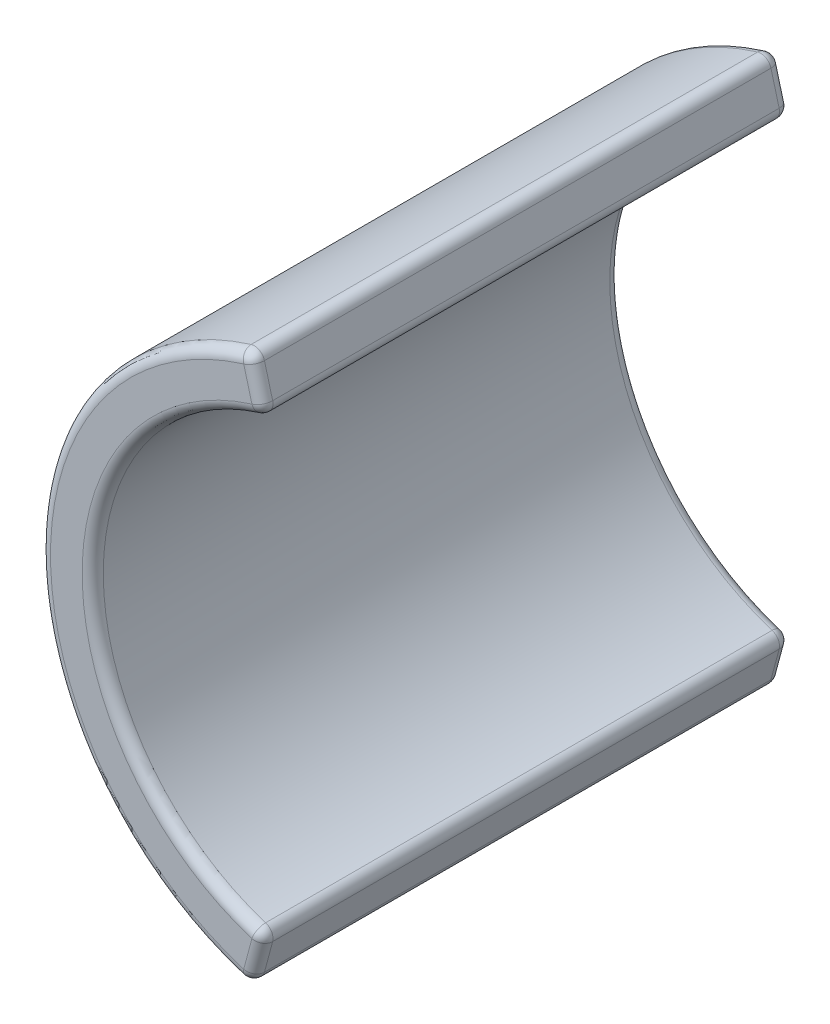
ISO-10303-21;
HEADER;
FILE_DESCRIPTION(('STEP AP214'),'2;1');
FILE_NAME('part.step','',(''),(''),'','','');
FILE_SCHEMA(('AUTOMOTIVE_DESIGN { 1 0 10303 214 1 1 1 1 }'));
ENDSEC;
DATA;
#1=APPLICATION_CONTEXT('core data for automotive mechanical design processes');
#2=APPLICATION_PROTOCOL_DEFINITION('international standard','automotive_design',2000,#1);
#3=PRODUCT_CONTEXT('',#1,'mechanical');
#4=PRODUCT('Part','Part','',(#3));
#5=PRODUCT_RELATED_PRODUCT_CATEGORY('part','',(#4));
#6=PRODUCT_DEFINITION_FORMATION('','',#4);
#7=PRODUCT_DEFINITION_CONTEXT('part definition',#1,'design');
#8=PRODUCT_DEFINITION('design','',#6,#7);
#9=PRODUCT_DEFINITION_SHAPE('','',#8);
#10=(LENGTH_UNIT() NAMED_UNIT(*) SI_UNIT(.MILLI.,.METRE.));
#11=(NAMED_UNIT(*) PLANE_ANGLE_UNIT() SI_UNIT($,.RADIAN.));
#12=(NAMED_UNIT(*) SI_UNIT($,.STERADIAN.) SOLID_ANGLE_UNIT());
#13=UNCERTAINTY_MEASURE_WITH_UNIT(LENGTH_MEASURE(1.E-05),#10,'distance_accuracy_value','');
#14=(GEOMETRIC_REPRESENTATION_CONTEXT(3) GLOBAL_UNCERTAINTY_ASSIGNED_CONTEXT((#13)) GLOBAL_UNIT_ASSIGNED_CONTEXT((#10,
#11,#12)) REPRESENTATION_CONTEXT('',''));
#15=CARTESIAN_POINT('',(0.,0.,0.));
#16=DIRECTION('',(0.,0.,1.));
#17=DIRECTION('',(1.,0.,0.));
#18=AXIS2_PLACEMENT_3D('',#15,#16,#17);
#19=CARTESIAN_POINT('',(0.,0.,0.));
#20=DIRECTION('',(0.,0.,1.));
#21=DIRECTION('',(1.,0.,0.));
#22=AXIS2_PLACEMENT_3D('',#19,#20,#21);
#23=CYLINDRICAL_SURFACE('',#22,13.5);
#24=DIRECTION('',(0.,0.,1.));
#25=VECTOR('',#24,1.);
#26=CARTESIAN_POINT('',(-3.99301020045834,12.8959633040357,0.));
#27=LINE('',#26,#25);
#28=CARTESIAN_POINT('',(-3.99301020045834,12.8959633040357,12.));
#29=VERTEX_POINT('',#28);
#30=CARTESIAN_POINT('',(-3.99301020045834,12.8959633040357,-12.));
#31=VERTEX_POINT('',#30);
#32=EDGE_CURVE('E139',#29,#31,#27,.F.);
#33=ORIENTED_EDGE('',*,*,#32,.T.);
#34=CARTESIAN_POINT('',(0.,0.,-12.));
#35=DIRECTION('',(0.,0.,1.));
#36=DIRECTION('',(1.,0.,0.));
#37=AXIS2_PLACEMENT_3D('',#34,#35,#36);
#38=CIRCLE('',#37,13.5);
#39=CARTESIAN_POINT('',(-3.99301020045834,-12.8959633040357,-12.));
#40=VERTEX_POINT('',#39);
#41=EDGE_CURVE('E135',#31,#40,#38,.T.);
#42=ORIENTED_EDGE('',*,*,#41,.T.);
#43=DIRECTION('',(0.,0.,1.));
#44=VECTOR('',#43,1.);
#45=CARTESIAN_POINT('',(-3.99301020045834,-12.8959633040357,0.));
#46=LINE('',#45,#44);
#47=CARTESIAN_POINT('',(-3.99301020045834,-12.8959633040357,12.));
#48=VERTEX_POINT('',#47);
#49=EDGE_CURVE('E130',#40,#48,#46,.T.);
#50=ORIENTED_EDGE('',*,*,#49,.T.);
#51=CARTESIAN_POINT('',(0.,0.,12.));
#52=DIRECTION('',(0.,0.,-1.));
#53=DIRECTION('',(-1.,0.,0.));
#54=AXIS2_PLACEMENT_3D('',#51,#52,#53);
#55=CIRCLE('',#54,13.5);
#56=EDGE_CURVE('E132',#48,#29,#55,.T.);
#57=ORIENTED_EDGE('',*,*,#56,.T.);
#58=EDGE_LOOP('',(#33,#42,#50,#57));
#59=FACE_BOUND('',#58,.T.);
#60=ADVANCED_FACE('F38',(#59),#23,.T.);
#61=CARTESIAN_POINT('',(-3.49405710888399,13.0399986549024,12.5));
#62=DIRECTION('',(0.,0.,-1.));
#63=DIRECTION('',(-1.,0.,0.));
#64=AXIS2_PLACEMENT_3D('',#61,#62,#63);
#65=PLANE('',#64);
#66=CARTESIAN_POINT('',(0.,0.,12.5));
#67=DIRECTION('',(0.,0.,-1.));
#68=DIRECTION('',(-1.,0.,0.));
#69=AXIS2_PLACEMENT_3D('',#66,#67,#68);
#70=CIRCLE('',#69,13.);
#71=CARTESIAN_POINT('',(-3.8451209337747,12.4183350335159,12.5));
#72=VERTEX_POINT('',#71);
#73=CARTESIAN_POINT('',(-3.8451209337747,-12.4183350335159,12.5));
#74=VERTEX_POINT('',#73);
#75=EDGE_CURVE('E47',#72,#74,#70,.F.);
#76=ORIENTED_EDGE('',*,*,#75,.T.);
#77=DIRECTION('',(0.258819045102518,0.965925826289069,0.));
#78=VECTOR('',#77,1.);
#79=CARTESIAN_POINT('',(2.54297930542262,11.4223796230117,12.5));
#80=LINE('',#79,#78);
#81=CARTESIAN_POINT('',(-3.45656735056167,-10.9682333195019,12.5));
#82=VERTEX_POINT('',#81);
#83=EDGE_CURVE('E11',#74,#82,#80,.T.);
#84=ORIENTED_EDGE('',*,*,#83,.T.);
#85=CARTESIAN_POINT('',(0.,0.,12.5));
#86=DIRECTION('',(0.,0.,-1.));
#87=DIRECTION('',(-1.,0.,0.));
#88=AXIS2_PLACEMENT_3D('',#85,#86,#87);
#89=CIRCLE('',#88,11.5);
#90=CARTESIAN_POINT('',(-3.45656735056167,10.9682333195019,12.5));
#91=VERTEX_POINT('',#90);
#92=EDGE_CURVE('E239',#82,#91,#89,.T.);
#93=ORIENTED_EDGE('',*,*,#92,.T.);
#94=DIRECTION('',(0.258819045102518,-0.965925826289069,0.));
#95=VECTOR('',#94,1.);
#96=CARTESIAN_POINT('',(-3.97702002202853,12.9105891323512,12.5));
#97=LINE('',#96,#95);
#98=EDGE_CURVE('E237',#91,#72,#97,.F.);
#99=ORIENTED_EDGE('',*,*,#98,.T.);
#100=EDGE_LOOP('',(#76,#84,#93,#99));
#101=FACE_BOUND('',#100,.T.);
#102=ADVANCED_FACE('F330',(#101),#65,.F.);
#103=CARTESIAN_POINT('',(0.,0.,0.));
#104=DIRECTION('',(0.,0.,1.));
#105=DIRECTION('',(1.,0.,0.));
#106=AXIS2_PLACEMENT_3D('',#103,#104,#105);
#107=CYLINDRICAL_SURFACE('',#106,11.);
#108=CARTESIAN_POINT('',(0.,0.,-12.));
#109=DIRECTION('',(0.,0.,1.));
#110=DIRECTION('',(1.,0.,0.));
#111=AXIS2_PLACEMENT_3D('',#108,#109,#110);
#112=CIRCLE('',#111,11.);
#113=CARTESIAN_POINT('',(-3.30628181358072,-10.4913536099583,-12.));
#114=VERTEX_POINT('',#113);
#115=CARTESIAN_POINT('',(-3.30628181358072,10.4913536099583,-12.));
#116=VERTEX_POINT('',#115);
#117=EDGE_CURVE('E222',#114,#116,#112,.F.);
#118=ORIENTED_EDGE('',*,*,#117,.T.);
#119=DIRECTION('',(0.,0.,1.));
#120=VECTOR('',#119,1.);
#121=CARTESIAN_POINT('',(-3.30628181358072,10.4913536099583,0.));
#122=LINE('',#121,#120);
#123=CARTESIAN_POINT('',(-3.30628181358072,10.4913536099583,12.));
#124=VERTEX_POINT('',#123);
#125=EDGE_CURVE('E219',#116,#124,#122,.T.);
#126=ORIENTED_EDGE('',*,*,#125,.T.);
#127=CARTESIAN_POINT('',(0.,0.,12.));
#128=DIRECTION('',(0.,0.,-1.));
#129=DIRECTION('',(-1.,0.,0.));
#130=AXIS2_PLACEMENT_3D('',#127,#128,#129);
#131=CIRCLE('',#130,11.);
#132=CARTESIAN_POINT('',(-3.30628181358072,-10.4913536099583,12.));
#133=VERTEX_POINT('',#132);
#134=EDGE_CURVE('E212',#124,#133,#131,.F.);
#135=ORIENTED_EDGE('',*,*,#134,.T.);
#136=DIRECTION('',(0.,0.,1.));
#137=VECTOR('',#136,1.);
#138=CARTESIAN_POINT('',(-3.30628181358072,-10.4913536099583,0.));
#139=LINE('',#138,#137);
#140=EDGE_CURVE('E215',#133,#114,#139,.F.);
#141=ORIENTED_EDGE('',*,*,#140,.T.);
#142=EDGE_LOOP('',(#118,#126,#135,#141));
#143=FACE_BOUND('',#142,.T.);
#144=ADVANCED_FACE('F220',(#143),#107,.F.);
#145=CARTESIAN_POINT('',(-3.49405710888399,13.0399986549024,-12.5));
#146=DIRECTION('',(0.,0.,1.));
#147=DIRECTION('',(1.,0.,0.));
#148=AXIS2_PLACEMENT_3D('',#145,#146,#147);
#149=PLANE('',#148);
#150=CARTESIAN_POINT('',(0.,0.,-12.5));
#151=DIRECTION('',(0.,0.,1.));
#152=DIRECTION('',(1.,0.,0.));
#153=AXIS2_PLACEMENT_3D('',#150,#151,#152);
#154=CIRCLE('',#153,11.5);
#155=CARTESIAN_POINT('',(-3.45656735056167,10.9682333195019,-12.5));
#156=VERTEX_POINT('',#155);
#157=CARTESIAN_POINT('',(-3.45656735056167,-10.9682333195019,-12.5));
#158=VERTEX_POINT('',#157);
#159=EDGE_CURVE('E267',#156,#158,#154,.T.);
#160=ORIENTED_EDGE('',*,*,#159,.T.);
#161=DIRECTION('',(-0.258819045102518,-0.965925826289069,0.));
#162=VECTOR('',#161,1.);
#163=CARTESIAN_POINT('',(2.54297930542262,11.4223796230117,-12.5));
#164=LINE('',#163,#162);
#165=CARTESIAN_POINT('',(-3.8451209337747,-12.4183350335159,-12.5));
#166=VERTEX_POINT('',#165);
#167=EDGE_CURVE('E273',#158,#166,#164,.T.);
#168=ORIENTED_EDGE('',*,*,#167,.T.);
#169=CARTESIAN_POINT('',(0.,0.,-12.5));
#170=DIRECTION('',(0.,0.,1.));
#171=DIRECTION('',(1.,0.,0.));
#172=AXIS2_PLACEMENT_3D('',#169,#170,#171);
#173=CIRCLE('',#172,13.);
#174=CARTESIAN_POINT('',(-3.8451209337747,12.4183350335159,-12.5));
#175=VERTEX_POINT('',#174);
#176=EDGE_CURVE('E270',#166,#175,#173,.F.);
#177=ORIENTED_EDGE('',*,*,#176,.T.);
#178=DIRECTION('',(-0.258819045102518,0.965925826289069,0.));
#179=VECTOR('',#178,1.);
#180=CARTESIAN_POINT('',(-3.32997240927223,10.4957745666285,-12.5));
#181=LINE('',#180,#179);
#182=EDGE_CURVE('E261',#175,#156,#181,.F.);
#183=ORIENTED_EDGE('',*,*,#182,.T.);
#184=EDGE_LOOP('',(#160,#168,#177,#183));
#185=FACE_BOUND('',#184,.T.);
#186=ADVANCED_FACE('F271',(#185),#149,.F.);
#187=CARTESIAN_POINT('',(-3.49405710888399,13.0399986549024,12.5));
#188=DIRECTION('',(0.965925826289069,0.258819045102518,0.));
#189=DIRECTION('',(0.,0.,1.));
#190=AXIS2_PLACEMENT_3D('',#187,#188,#189);
#191=PLANE('',#190);
#192=DIRECTION('',(0.,0.,-1.));
#193=VECTOR('',#192,1.);
#194=CARTESIAN_POINT('',(-2.97360443741713,11.0976428420531,-12.5));
#195=LINE('',#194,#193);
#196=CARTESIAN_POINT('',(-2.97360443741713,11.0976428420531,12.));
#197=VERTEX_POINT('',#196);
#198=CARTESIAN_POINT('',(-2.97360443741713,11.0976428420531,-12.));
#199=VERTEX_POINT('',#198);
#200=EDGE_CURVE('E285',#197,#199,#195,.T.);
#201=ORIENTED_EDGE('',*,*,#200,.T.);
#202=DIRECTION('',(-0.258819045102518,0.965925826289069,0.));
#203=VECTOR('',#202,1.);
#204=CARTESIAN_POINT('',(-3.49405710888399,13.0399986549024,-12.));
#205=LINE('',#204,#203);
#206=CARTESIAN_POINT('',(-3.36215802063016,12.5477445560671,-12.));
#207=VERTEX_POINT('',#206);
#208=EDGE_CURVE('E216',#199,#207,#205,.T.);
#209=ORIENTED_EDGE('',*,*,#208,.T.);
#210=DIRECTION('',(0.,0.,-1.));
#211=VECTOR('',#210,1.);
#212=CARTESIAN_POINT('',(-3.36215802063016,12.5477445560671,12.5));
#213=LINE('',#212,#211);
#214=CARTESIAN_POINT('',(-3.36215802063016,12.5477445560671,12.));
#215=VERTEX_POINT('',#214);
#216=EDGE_CURVE('E283',#207,#215,#213,.F.);
#217=ORIENTED_EDGE('',*,*,#216,.T.);
#218=DIRECTION('',(0.258819045102518,-0.965925826289069,0.));
#219=VECTOR('',#218,1.);
#220=CARTESIAN_POINT('',(-2.8470094961277,10.6251840891798,12.));
#221=LINE('',#220,#219);
#222=EDGE_CURVE('E278',#215,#197,#221,.T.);
#223=ORIENTED_EDGE('',*,*,#222,.T.);
#224=EDGE_LOOP('',(#201,#209,#217,#223));
#225=FACE_BOUND('',#224,.T.);
#226=ADVANCED_FACE('F313',(#225),#191,.T.);
#227=CARTESIAN_POINT('',(-3.49405710888399,-13.0399986549024,12.5));
#228=DIRECTION('',(-0.965925826289069,0.258819045102518,0.));
#229=DIRECTION('',(0.,0.,1.));
#230=AXIS2_PLACEMENT_3D('',#227,#228,#229);
#231=PLANE('',#230);
#232=DIRECTION('',(0.,0.,1.));
#233=VECTOR('',#232,1.);
#234=CARTESIAN_POINT('',(-3.36215802063016,-12.5477445560671,12.5));
#235=LINE('',#234,#233);
#236=CARTESIAN_POINT('',(-3.36215802063016,-12.5477445560671,12.));
#237=VERTEX_POINT('',#236);
#238=CARTESIAN_POINT('',(-3.36215802063016,-12.5477445560671,-12.));
#239=VERTEX_POINT('',#238);
#240=EDGE_CURVE('E155',#237,#239,#235,.F.);
#241=ORIENTED_EDGE('',*,*,#240,.T.);
#242=DIRECTION('',(-0.258819045102518,-0.965925826289069,0.));
#243=VECTOR('',#242,1.);
#244=CARTESIAN_POINT('',(-3.49405710888399,-13.0399986549024,-12.));
#245=LINE('',#244,#243);
#246=CARTESIAN_POINT('',(-2.97360443741713,-11.0976428420531,-12.));
#247=VERTEX_POINT('',#246);
#248=EDGE_CURVE('E235',#239,#247,#245,.F.);
#249=ORIENTED_EDGE('',*,*,#248,.T.);
#250=DIRECTION('',(0.,0.,1.));
#251=VECTOR('',#250,1.);
#252=CARTESIAN_POINT('',(-2.97360443741713,-11.0976428420531,12.5));
#253=LINE('',#252,#251);
#254=CARTESIAN_POINT('',(-2.97360443741713,-11.0976428420531,12.));
#255=VERTEX_POINT('',#254);
#256=EDGE_CURVE('E228',#247,#255,#253,.T.);
#257=ORIENTED_EDGE('',*,*,#256,.T.);
#258=DIRECTION('',(0.258819045102518,0.965925826289069,0.));
#259=VECTOR('',#258,1.);
#260=CARTESIAN_POINT('',(-3.49405710888399,-13.0399986549024,12.));
#261=LINE('',#260,#259);
#262=EDGE_CURVE('E226',#255,#237,#261,.F.);
#263=ORIENTED_EDGE('',*,*,#262,.T.);
#264=EDGE_LOOP('',(#241,#249,#257,#263));
#265=FACE_BOUND('',#264,.T.);
#266=ADVANCED_FACE('F486',(#265),#231,.F.);
#267=CARTESIAN_POINT('',(0.,0.,12.));
#268=DIRECTION('',(0.,0.,-1.));
#269=DIRECTION('',(-1.,0.,0.));
#270=AXIS2_PLACEMENT_3D('',#267,#268,#269);
#271=TOROIDAL_SURFACE('',#270,11.5,0.5);
#272=CARTESIAN_POINT('',(-3.45656735056167,10.9682333195019,12.));
#273=DIRECTION('',(0.95375941908712,0.300571073961883,0.));
#274=DIRECTION('',(-0.300571073961883,0.95375941908712,0.));
#275=AXIS2_PLACEMENT_3D('',#272,#273,#274);
#276=CIRCLE('',#275,0.5);
#277=EDGE_CURVE('E42',#91,#124,#276,.T.);
#278=ORIENTED_EDGE('',*,*,#277,.F.);
#279=ORIENTED_EDGE('',*,*,#92,.F.);
#280=CARTESIAN_POINT('',(-3.45656735056167,-10.9682333195019,12.));
#281=DIRECTION('',(0.95375941908712,-0.300571073961883,0.));
#282=DIRECTION('',(0.300571073961883,0.95375941908712,0.));
#283=AXIS2_PLACEMENT_3D('',#280,#281,#282);
#284=CIRCLE('',#283,0.5);
#285=EDGE_CURVE('E196',#133,#82,#284,.T.);
#286=ORIENTED_EDGE('',*,*,#285,.F.);
#287=ORIENTED_EDGE('',*,*,#134,.F.);
#288=EDGE_LOOP('',(#278,#279,#286,#287));
#289=FACE_BOUND('',#288,.T.);
#290=ADVANCED_FACE('F40',(#289),#271,.T.);
#291=CARTESIAN_POINT('',(-3.45656735056167,10.9682333195019,12.));
#292=DIRECTION('',(0.,0.,1.));
#293=DIRECTION('',(1.,0.,0.));
#294=AXIS2_PLACEMENT_3D('',#291,#292,#293);
#295=SPHERICAL_SURFACE('',#294,0.5);
#296=CARTESIAN_POINT('',(-3.45656735056167,10.9682333195019,12.));
#297=DIRECTION('',(0.258819045102519,-0.965925826289069,0.));
#298=DIRECTION('',(0.965925826289069,0.258819045102519,0.));
#299=AXIS2_PLACEMENT_3D('',#296,#297,#298);
#300=CIRCLE('',#299,0.5);
#301=EDGE_CURVE('E192',#91,#197,#300,.F.);
#302=ORIENTED_EDGE('',*,*,#301,.F.);
#303=ORIENTED_EDGE('',*,*,#277,.T.);
#304=CARTESIAN_POINT('',(-3.45656735056167,10.9682333195019,12.));
#305=DIRECTION('',(0.,0.,1.));
#306=DIRECTION('',(1.,0.,0.));
#307=AXIS2_PLACEMENT_3D('',#304,#305,#306);
#308=CIRCLE('',#307,0.5);
#309=EDGE_CURVE('E195',#197,#124,#308,.F.);
#310=ORIENTED_EDGE('',*,*,#309,.F.);
#311=EDGE_LOOP('',(#302,#303,#310));
#312=FACE_BOUND('',#311,.T.);
#313=ADVANCED_FACE('F208',(#312),#295,.T.);
#314=CARTESIAN_POINT('',(-3.45656735056167,-10.9682333195019,12.));
#315=DIRECTION('',(0.,0.,1.));
#316=DIRECTION('',(1.,0.,0.));
#317=AXIS2_PLACEMENT_3D('',#314,#315,#316);
#318=SPHERICAL_SURFACE('',#317,0.5);
#319=CARTESIAN_POINT('',(-3.45656735056167,-10.9682333195019,12.));
#320=DIRECTION('',(0.,0.,1.));
#321=DIRECTION('',(1.,0.,0.));
#322=AXIS2_PLACEMENT_3D('',#319,#320,#321);
#323=CIRCLE('',#322,0.5);
#324=EDGE_CURVE('E186',#133,#255,#323,.F.);
#325=ORIENTED_EDGE('',*,*,#324,.F.);
#326=ORIENTED_EDGE('',*,*,#285,.T.);
#327=CARTESIAN_POINT('',(-3.45656735056167,-10.9682333195019,12.));
#328=DIRECTION('',(0.258819045102516,0.96592582628907,0.));
#329=DIRECTION('',(-0.96592582628907,0.258819045102516,0.));
#330=AXIS2_PLACEMENT_3D('',#327,#328,#329);
#331=CIRCLE('',#330,0.5);
#332=EDGE_CURVE('E189',#255,#82,#331,.F.);
#333=ORIENTED_EDGE('',*,*,#332,.F.);
#334=EDGE_LOOP('',(#325,#326,#333));
#335=FACE_BOUND('',#334,.T.);
#336=ADVANCED_FACE('F465',(#335),#318,.T.);
#337=CARTESIAN_POINT('',(-3.45656735056167,10.9682333195019,0.));
#338=DIRECTION('',(0.,0.,1.));
#339=DIRECTION('',(1.,0.,0.));
#340=AXIS2_PLACEMENT_3D('',#337,#338,#339);
#341=CYLINDRICAL_SURFACE('',#340,0.5);
#342=ORIENTED_EDGE('',*,*,#309,.T.);
#343=ORIENTED_EDGE('',*,*,#125,.F.);
#344=CARTESIAN_POINT('',(-3.45656735056167,10.9682333195019,-12.));
#345=DIRECTION('',(0.,0.,-1.));
#346=DIRECTION('',(-1.,0.,0.));
#347=AXIS2_PLACEMENT_3D('',#344,#345,#346);
#348=CIRCLE('',#347,0.5);
#349=EDGE_CURVE('E180',#199,#116,#348,.T.);
#350=ORIENTED_EDGE('',*,*,#349,.F.);
#351=ORIENTED_EDGE('',*,*,#200,.F.);
#352=EDGE_LOOP('',(#342,#343,#350,#351));
#353=FACE_BOUND('',#352,.T.);
#354=ADVANCED_FACE('F457',(#353),#341,.T.);
#355=CARTESIAN_POINT('',(-3.97702002202853,12.9105891323512,12.));
#356=DIRECTION('',(-0.258819045102518,0.965925826289069,0.));
#357=DIRECTION('',(-0.965925826289069,-0.258819045102518,0.));
#358=AXIS2_PLACEMENT_3D('',#355,#356,#357);
#359=CYLINDRICAL_SURFACE('',#358,0.5);
#360=ORIENTED_EDGE('',*,*,#301,.T.);
#361=ORIENTED_EDGE('',*,*,#222,.F.);
#362=CARTESIAN_POINT('',(-3.8451209337747,12.4183350335159,12.));
#363=DIRECTION('',(-0.258819045102519,0.965925826289069,0.));
#364=DIRECTION('',(-0.965925826289069,-0.258819045102519,0.));
#365=AXIS2_PLACEMENT_3D('',#362,#363,#364);
#366=CIRCLE('',#365,0.5);
#367=EDGE_CURVE('E177',#72,#215,#366,.T.);
#368=ORIENTED_EDGE('',*,*,#367,.F.);
#369=ORIENTED_EDGE('',*,*,#98,.F.);
#370=EDGE_LOOP('',(#360,#361,#368,#369));
#371=FACE_BOUND('',#370,.T.);
#372=ADVANCED_FACE('F316',(#371),#359,.T.);
#373=CARTESIAN_POINT('',(0.,0.,12.));
#374=DIRECTION('',(0.,0.,-1.));
#375=DIRECTION('',(-1.,0.,0.));
#376=AXIS2_PLACEMENT_3D('',#373,#374,#375);
#377=TOROIDAL_SURFACE('',#376,13.,0.5);
#378=CARTESIAN_POINT('',(-3.8451209337747,-12.4183350335159,12.));
#379=DIRECTION('',(0.955256541039682,-0.295778533367284,0.));
#380=DIRECTION('',(0.295778533367284,0.955256541039682,0.));
#381=AXIS2_PLACEMENT_3D('',#378,#379,#380);
#382=CIRCLE('',#381,0.5);
#383=EDGE_CURVE('E144',#74,#48,#382,.T.);
#384=ORIENTED_EDGE('',*,*,#383,.F.);
#385=ORIENTED_EDGE('',*,*,#75,.F.);
#386=CARTESIAN_POINT('',(-3.8451209337747,12.4183350335159,12.));
#387=DIRECTION('',(0.955256541039682,0.295778533367284,0.));
#388=DIRECTION('',(-0.295778533367284,0.955256541039682,0.));
#389=AXIS2_PLACEMENT_3D('',#386,#387,#388);
#390=CIRCLE('',#389,0.5);
#391=EDGE_CURVE('E146',#29,#72,#390,.T.);
#392=ORIENTED_EDGE('',*,*,#391,.F.);
#393=ORIENTED_EDGE('',*,*,#56,.F.);
#394=EDGE_LOOP('',(#384,#385,#392,#393));
#395=FACE_BOUND('',#394,.T.);
#396=ADVANCED_FACE('F142',(#395),#377,.T.);
#397=CARTESIAN_POINT('',(2.54297930542262,11.4223796230117,12.));
#398=DIRECTION('',(0.258819045102518,0.965925826289069,0.));
#399=DIRECTION('',(-0.965925826289069,0.258819045102518,0.));
#400=AXIS2_PLACEMENT_3D('',#397,#398,#399);
#401=CYLINDRICAL_SURFACE('',#400,0.5);
#402=ORIENTED_EDGE('',*,*,#332,.T.);
#403=ORIENTED_EDGE('',*,*,#83,.F.);
#404=CARTESIAN_POINT('',(-3.8451209337747,-12.4183350335159,12.));
#405=DIRECTION('',(-0.258819045102519,-0.965925826289069,0.));
#406=DIRECTION('',(0.965925826289069,-0.258819045102519,0.));
#407=AXIS2_PLACEMENT_3D('',#404,#405,#406);
#408=CIRCLE('',#407,0.5);
#409=EDGE_CURVE('E55',#237,#74,#408,.T.);
#410=ORIENTED_EDGE('',*,*,#409,.F.);
#411=ORIENTED_EDGE('',*,*,#262,.F.);
#412=EDGE_LOOP('',(#402,#403,#410,#411));
#413=FACE_BOUND('',#412,.T.);
#414=ADVANCED_FACE('F434',(#413),#401,.T.);
#415=CARTESIAN_POINT('',(-3.45656735056167,-10.9682333195019,0.));
#416=DIRECTION('',(0.,0.,1.));
#417=DIRECTION('',(1.,0.,0.));
#418=AXIS2_PLACEMENT_3D('',#415,#416,#417);
#419=CYLINDRICAL_SURFACE('',#418,0.5);
#420=ORIENTED_EDGE('',*,*,#324,.T.);
#421=ORIENTED_EDGE('',*,*,#256,.F.);
#422=CARTESIAN_POINT('',(-3.45656735056167,-10.9682333195019,-12.));
#423=DIRECTION('',(0.,0.,-1.));
#424=DIRECTION('',(-1.,0.,0.));
#425=AXIS2_PLACEMENT_3D('',#422,#423,#424);
#426=CIRCLE('',#425,0.5);
#427=EDGE_CURVE('E172',#114,#247,#426,.T.);
#428=ORIENTED_EDGE('',*,*,#427,.F.);
#429=ORIENTED_EDGE('',*,*,#140,.F.);
#430=EDGE_LOOP('',(#420,#421,#428,#429));
#431=FACE_BOUND('',#430,.T.);
#432=ADVANCED_FACE('F296',(#431),#419,.T.);
#433=CARTESIAN_POINT('',(0.,0.,-12.));
#434=DIRECTION('',(0.,0.,1.));
#435=DIRECTION('',(1.,0.,0.));
#436=AXIS2_PLACEMENT_3D('',#433,#434,#435);
#437=TOROIDAL_SURFACE('',#436,11.5,0.5);
#438=CARTESIAN_POINT('',(-3.45656735056167,10.9682333195019,-12.));
#439=DIRECTION('',(0.95375941908712,0.300571073961883,0.));
#440=DIRECTION('',(-0.300571073961883,0.95375941908712,0.));
#441=AXIS2_PLACEMENT_3D('',#438,#439,#440);
#442=CIRCLE('',#441,0.5);
#443=EDGE_CURVE('E183',#116,#156,#442,.T.);
#444=ORIENTED_EDGE('',*,*,#443,.F.);
#445=ORIENTED_EDGE('',*,*,#117,.F.);
#446=CARTESIAN_POINT('',(-3.45656735056167,-10.9682333195019,-12.));
#447=DIRECTION('',(0.95375941908712,-0.300571073961882,0.));
#448=DIRECTION('',(0.300571073961882,0.95375941908712,0.));
#449=AXIS2_PLACEMENT_3D('',#446,#447,#448);
#450=CIRCLE('',#449,0.5);
#451=EDGE_CURVE('E169',#158,#114,#450,.T.);
#452=ORIENTED_EDGE('',*,*,#451,.F.);
#453=ORIENTED_EDGE('',*,*,#159,.F.);
#454=EDGE_LOOP('',(#444,#445,#452,#453));
#455=FACE_BOUND('',#454,.T.);
#456=ADVANCED_FACE('F293',(#455),#437,.T.);
#457=CARTESIAN_POINT('',(-3.45656735056167,10.9682333195019,-12.));
#458=DIRECTION('',(0.,0.,1.));
#459=DIRECTION('',(1.,0.,0.));
#460=AXIS2_PLACEMENT_3D('',#457,#458,#459);
#461=SPHERICAL_SURFACE('',#460,0.5);
#462=ORIENTED_EDGE('',*,*,#349,.T.);
#463=ORIENTED_EDGE('',*,*,#443,.T.);
#464=CARTESIAN_POINT('',(-3.45656735056167,10.9682333195019,-12.));
#465=DIRECTION('',(0.258819045102519,-0.965925826289069,0.));
#466=DIRECTION('',(0.965925826289069,0.258819045102519,0.));
#467=AXIS2_PLACEMENT_3D('',#464,#465,#466);
#468=CIRCLE('',#467,0.5);
#469=EDGE_CURVE('E160',#199,#156,#468,.F.);
#470=ORIENTED_EDGE('',*,*,#469,.F.);
#471=EDGE_LOOP('',(#462,#463,#470));
#472=FACE_BOUND('',#471,.T.);
#473=ADVANCED_FACE('F320',(#472),#461,.T.);
#474=CARTESIAN_POINT('',(-3.8451209337747,12.4183350335159,12.));
#475=DIRECTION('',(0.,0.,1.));
#476=DIRECTION('',(1.,0.,0.));
#477=AXIS2_PLACEMENT_3D('',#474,#475,#476);
#478=SPHERICAL_SURFACE('',#477,0.5);
#479=ORIENTED_EDGE('',*,*,#391,.T.);
#480=ORIENTED_EDGE('',*,*,#367,.T.);
#481=CARTESIAN_POINT('',(-3.8451209337747,12.4183350335159,12.));
#482=DIRECTION('',(0.,0.,1.));
#483=DIRECTION('',(1.,0.,0.));
#484=AXIS2_PLACEMENT_3D('',#481,#482,#483);
#485=CIRCLE('',#484,0.5);
#486=EDGE_CURVE('E156',#29,#215,#485,.F.);
#487=ORIENTED_EDGE('',*,*,#486,.F.);
#488=EDGE_LOOP('',(#479,#480,#487));
#489=FACE_BOUND('',#488,.T.);
#490=ADVANCED_FACE('F318',(#489),#478,.T.);
#491=CARTESIAN_POINT('',(-3.8451209337747,-12.4183350335159,12.));
#492=DIRECTION('',(0.,0.,1.));
#493=DIRECTION('',(1.,0.,0.));
#494=AXIS2_PLACEMENT_3D('',#491,#492,#493);
#495=SPHERICAL_SURFACE('',#494,0.5);
#496=ORIENTED_EDGE('',*,*,#409,.T.);
#497=ORIENTED_EDGE('',*,*,#383,.T.);
#498=CARTESIAN_POINT('',(-3.8451209337747,-12.4183350335159,12.));
#499=DIRECTION('',(0.,0.,1.));
#500=DIRECTION('',(1.,0.,0.));
#501=AXIS2_PLACEMENT_3D('',#498,#499,#500);
#502=CIRCLE('',#501,0.5);
#503=EDGE_CURVE('E150',#237,#48,#502,.F.);
#504=ORIENTED_EDGE('',*,*,#503,.F.);
#505=EDGE_LOOP('',(#496,#497,#504));
#506=FACE_BOUND('',#505,.T.);
#507=ADVANCED_FACE('F149',(#506),#495,.T.);
#508=CARTESIAN_POINT('',(-3.45656735056167,-10.9682333195019,-12.));
#509=DIRECTION('',(0.,0.,1.));
#510=DIRECTION('',(1.,0.,0.));
#511=AXIS2_PLACEMENT_3D('',#508,#509,#510);
#512=SPHERICAL_SURFACE('',#511,0.5);
#513=ORIENTED_EDGE('',*,*,#451,.T.);
#514=ORIENTED_EDGE('',*,*,#427,.T.);
#515=CARTESIAN_POINT('',(-3.45656735056167,-10.9682333195019,-12.));
#516=DIRECTION('',(0.258819045102519,0.965925826289069,0.));
#517=DIRECTION('',(-0.965925826289069,0.258819045102519,0.));
#518=AXIS2_PLACEMENT_3D('',#515,#516,#517);
#519=CIRCLE('',#518,0.5);
#520=EDGE_CURVE('E157',#158,#247,#519,.F.);
#521=ORIENTED_EDGE('',*,*,#520,.F.);
#522=EDGE_LOOP('',(#513,#514,#521));
#523=FACE_BOUND('',#522,.T.);
#524=ADVANCED_FACE('F298',(#523),#512,.T.);
#525=CARTESIAN_POINT('',(-3.97702002202853,12.9105891323512,-12.));
#526=DIRECTION('',(0.258819045102518,-0.965925826289069,0.));
#527=DIRECTION('',(0.965925826289069,0.258819045102518,0.));
#528=AXIS2_PLACEMENT_3D('',#525,#526,#527);
#529=CYLINDRICAL_SURFACE('',#528,0.5);
#530=ORIENTED_EDGE('',*,*,#469,.T.);
#531=ORIENTED_EDGE('',*,*,#182,.F.);
#532=CARTESIAN_POINT('',(-3.8451209337747,12.4183350335159,-12.));
#533=DIRECTION('',(-0.258819045102519,0.965925826289069,0.));
#534=DIRECTION('',(-0.965925826289069,-0.258819045102519,0.));
#535=AXIS2_PLACEMENT_3D('',#532,#533,#534);
#536=CIRCLE('',#535,0.5);
#537=EDGE_CURVE('E163',#207,#175,#536,.T.);
#538=ORIENTED_EDGE('',*,*,#537,.F.);
#539=ORIENTED_EDGE('',*,*,#208,.F.);
#540=EDGE_LOOP('',(#530,#531,#538,#539));
#541=FACE_BOUND('',#540,.T.);
#542=ADVANCED_FACE('F263',(#541),#529,.T.);
#543=CARTESIAN_POINT('',(-3.8451209337747,12.4183350335159,0.));
#544=DIRECTION('',(0.,0.,1.));
#545=DIRECTION('',(1.,0.,0.));
#546=AXIS2_PLACEMENT_3D('',#543,#544,#545);
#547=CYLINDRICAL_SURFACE('',#546,0.5);
#548=ORIENTED_EDGE('',*,*,#486,.T.);
#549=ORIENTED_EDGE('',*,*,#216,.F.);
#550=CARTESIAN_POINT('',(-3.8451209337747,12.4183350335159,-12.));
#551=DIRECTION('',(0.,0.,-1.));
#552=DIRECTION('',(-1.,0.,0.));
#553=AXIS2_PLACEMENT_3D('',#550,#551,#552);
#554=CIRCLE('',#553,0.5);
#555=EDGE_CURVE('E251',#31,#207,#554,.T.);
#556=ORIENTED_EDGE('',*,*,#555,.F.);
#557=ORIENTED_EDGE('',*,*,#32,.F.);
#558=EDGE_LOOP('',(#548,#549,#556,#557));
#559=FACE_BOUND('',#558,.T.);
#560=ADVANCED_FACE('F310',(#559),#547,.T.);
#561=CARTESIAN_POINT('',(-3.8451209337747,-12.4183350335159,0.));
#562=DIRECTION('',(0.,0.,1.));
#563=DIRECTION('',(1.,0.,0.));
#564=AXIS2_PLACEMENT_3D('',#561,#562,#563);
#565=CYLINDRICAL_SURFACE('',#564,0.5);
#566=ORIENTED_EDGE('',*,*,#503,.T.);
#567=ORIENTED_EDGE('',*,*,#49,.F.);
#568=CARTESIAN_POINT('',(-3.8451209337747,-12.4183350335159,-12.));
#569=DIRECTION('',(0.,0.,-1.));
#570=DIRECTION('',(-1.,0.,0.));
#571=AXIS2_PLACEMENT_3D('',#568,#569,#570);
#572=CIRCLE('',#571,0.5);
#573=EDGE_CURVE('E248',#239,#40,#572,.T.);
#574=ORIENTED_EDGE('',*,*,#573,.F.);
#575=ORIENTED_EDGE('',*,*,#240,.F.);
#576=EDGE_LOOP('',(#566,#567,#574,#575));
#577=FACE_BOUND('',#576,.T.);
#578=ADVANCED_FACE('F153',(#577),#565,.T.);
#579=CARTESIAN_POINT('',(2.54297930542262,11.4223796230117,-12.));
#580=DIRECTION('',(-0.258819045102518,-0.965925826289069,0.));
#581=DIRECTION('',(0.965925826289069,-0.258819045102518,0.));
#582=AXIS2_PLACEMENT_3D('',#579,#580,#581);
#583=CYLINDRICAL_SURFACE('',#582,0.5);
#584=ORIENTED_EDGE('',*,*,#520,.T.);
#585=ORIENTED_EDGE('',*,*,#248,.F.);
#586=CARTESIAN_POINT('',(-3.8451209337747,-12.4183350335159,-12.));
#587=DIRECTION('',(-0.258819045102516,-0.96592582628907,0.));
#588=DIRECTION('',(0.96592582628907,-0.258819045102516,0.));
#589=AXIS2_PLACEMENT_3D('',#586,#587,#588);
#590=CIRCLE('',#589,0.5);
#591=EDGE_CURVE('E246',#166,#239,#590,.T.);
#592=ORIENTED_EDGE('',*,*,#591,.F.);
#593=ORIENTED_EDGE('',*,*,#167,.F.);
#594=EDGE_LOOP('',(#584,#585,#592,#593));
#595=FACE_BOUND('',#594,.T.);
#596=ADVANCED_FACE('F301',(#595),#583,.T.);
#597=CARTESIAN_POINT('',(-3.8451209337747,12.4183350335159,-12.));
#598=DIRECTION('',(0.,0.,1.));
#599=DIRECTION('',(1.,0.,0.));
#600=AXIS2_PLACEMENT_3D('',#597,#598,#599);
#601=SPHERICAL_SURFACE('',#600,0.5);
#602=ORIENTED_EDGE('',*,*,#555,.T.);
#603=ORIENTED_EDGE('',*,*,#537,.T.);
#604=CARTESIAN_POINT('',(-3.8451209337747,12.4183350335159,-12.));
#605=DIRECTION('',(0.955256541039682,0.295778533367286,0.));
#606=DIRECTION('',(-0.295778533367286,0.955256541039682,0.));
#607=AXIS2_PLACEMENT_3D('',#604,#605,#606);
#608=CIRCLE('',#607,0.5);
#609=EDGE_CURVE('E244',#31,#175,#608,.F.);
#610=ORIENTED_EDGE('',*,*,#609,.F.);
#611=EDGE_LOOP('',(#602,#603,#610));
#612=FACE_BOUND('',#611,.T.);
#613=ADVANCED_FACE('F258',(#612),#601,.T.);
#614=CARTESIAN_POINT('',(-3.8451209337747,-12.4183350335159,-12.));
#615=DIRECTION('',(0.,0.,1.));
#616=DIRECTION('',(1.,0.,0.));
#617=AXIS2_PLACEMENT_3D('',#614,#615,#616);
#618=SPHERICAL_SURFACE('',#617,0.5);
#619=ORIENTED_EDGE('',*,*,#591,.T.);
#620=ORIENTED_EDGE('',*,*,#573,.T.);
#621=CARTESIAN_POINT('',(-3.8451209337747,-12.4183350335159,-12.));
#622=DIRECTION('',(0.955256541039682,-0.295778533367284,0.));
#623=DIRECTION('',(0.295778533367284,0.955256541039682,0.));
#624=AXIS2_PLACEMENT_3D('',#621,#622,#623);
#625=CIRCLE('',#624,0.5);
#626=EDGE_CURVE('E242',#166,#40,#625,.F.);
#627=ORIENTED_EDGE('',*,*,#626,.F.);
#628=EDGE_LOOP('',(#619,#620,#627));
#629=FACE_BOUND('',#628,.T.);
#630=ADVANCED_FACE('F303',(#629),#618,.T.);
#631=CARTESIAN_POINT('',(0.,0.,-12.));
#632=DIRECTION('',(0.,0.,1.));
#633=DIRECTION('',(1.,0.,0.));
#634=AXIS2_PLACEMENT_3D('',#631,#632,#633);
#635=TOROIDAL_SURFACE('',#634,13.,0.5);
#636=ORIENTED_EDGE('',*,*,#609,.T.);
#637=ORIENTED_EDGE('',*,*,#176,.F.);
#638=ORIENTED_EDGE('',*,*,#626,.T.);
#639=ORIENTED_EDGE('',*,*,#41,.F.);
#640=EDGE_LOOP('',(#636,#637,#638,#639));
#641=FACE_BOUND('',#640,.T.);
#642=ADVANCED_FACE('F304',(#641),#635,.T.);
#643=CLOSED_SHELL('',(#60,#102,#144,#186,#226,#266,#290,#313,#336,#354,#372,#396,#414,#432,#456,
#473,#490,#507,#524,#542,#560,#578,#596,#613,#630,#642));
#644=MANIFOLD_SOLID_BREP('B2',#643);
#645=ADVANCED_BREP_SHAPE_REPRESENTATION('',(#18,#644),#14);
#646=SHAPE_DEFINITION_REPRESENTATION(#9,#645);
ENDSEC;
END-ISO-10303-21;
